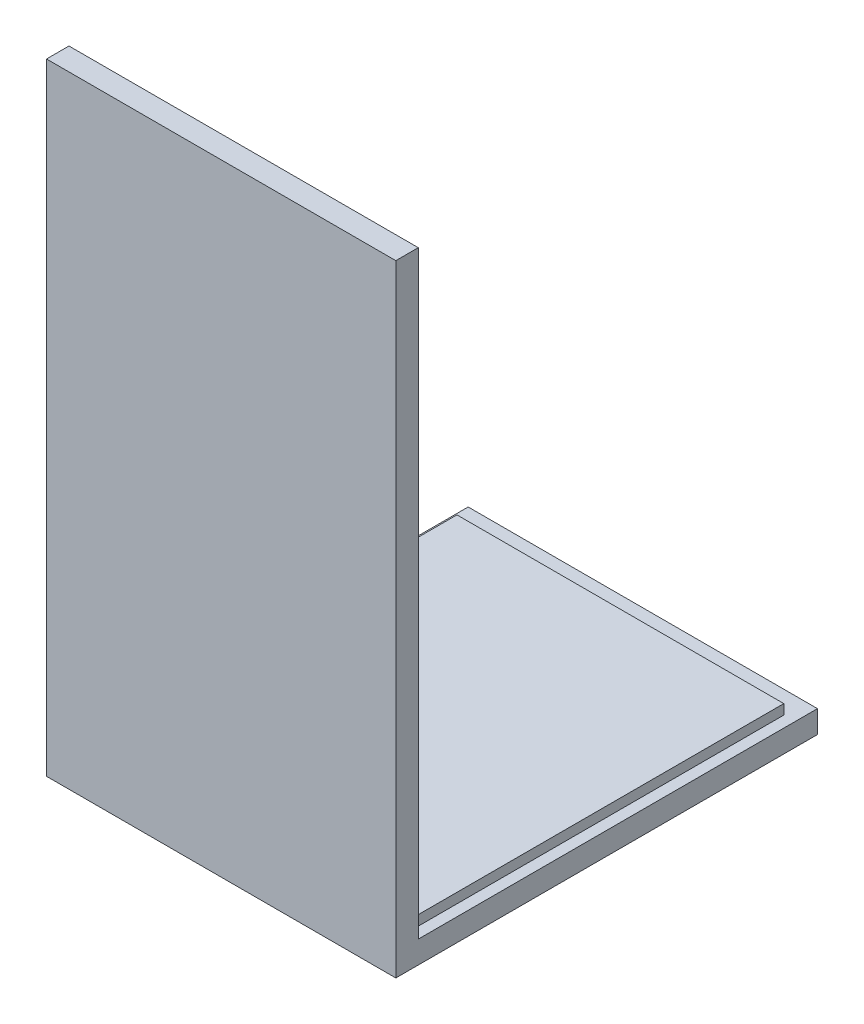
ISO-10303-21;
HEADER;
FILE_DESCRIPTION(('STEP AP214'),'2;1');
FILE_NAME('part.step','',(''),(''),'','','');
FILE_SCHEMA(('AUTOMOTIVE_DESIGN { 1 0 10303 214 1 1 1 1 }'));
ENDSEC;
DATA;
#1=APPLICATION_CONTEXT('core data for automotive mechanical design processes');
#2=APPLICATION_PROTOCOL_DEFINITION('international standard','automotive_design',2000,#1);
#3=PRODUCT_CONTEXT('',#1,'mechanical');
#4=PRODUCT('Part','Part','',(#3));
#5=PRODUCT_RELATED_PRODUCT_CATEGORY('part','',(#4));
#6=PRODUCT_DEFINITION_FORMATION('','',#4);
#7=PRODUCT_DEFINITION_CONTEXT('part definition',#1,'design');
#8=PRODUCT_DEFINITION('design','',#6,#7);
#9=PRODUCT_DEFINITION_SHAPE('','',#8);
#10=(LENGTH_UNIT() NAMED_UNIT(*) SI_UNIT(.MILLI.,.METRE.));
#11=(NAMED_UNIT(*) PLANE_ANGLE_UNIT() SI_UNIT($,.RADIAN.));
#12=(NAMED_UNIT(*) SI_UNIT($,.STERADIAN.) SOLID_ANGLE_UNIT());
#13=UNCERTAINTY_MEASURE_WITH_UNIT(LENGTH_MEASURE(1.E-05),#10,'distance_accuracy_value','');
#14=(GEOMETRIC_REPRESENTATION_CONTEXT(3) GLOBAL_UNCERTAINTY_ASSIGNED_CONTEXT((#13)) GLOBAL_UNIT_ASSIGNED_CONTEXT((#10,
#11,#12)) REPRESENTATION_CONTEXT('',''));
#15=CARTESIAN_POINT('',(0.,0.,0.));
#16=DIRECTION('',(0.,0.,1.));
#17=DIRECTION('',(1.,0.,0.));
#18=AXIS2_PLACEMENT_3D('',#15,#16,#17);
#19=CARTESIAN_POINT('',(0.,0.,0.));
#20=DIRECTION('',(0.,0.,-1.));
#21=DIRECTION('',(-1.,0.,0.));
#22=AXIS2_PLACEMENT_3D('',#19,#20,#21);
#23=PLANE('',#22);
#24=DIRECTION('',(1.,0.,0.));
#25=VECTOR('',#24,1.);
#26=CARTESIAN_POINT('',(-67.75,6.5,0.));
#27=LINE('',#26,#25);
#28=CARTESIAN_POINT('',(-67.75,6.5,0.));
#29=VERTEX_POINT('',#28);
#30=CARTESIAN_POINT('',(-2.25,6.5,0.));
#31=VERTEX_POINT('',#30);
#32=EDGE_CURVE('E142',#29,#31,#27,.T.);
#33=ORIENTED_EDGE('',*,*,#32,.F.);
#34=DIRECTION('',(0.,1.,0.));
#35=VECTOR('',#34,1.);
#36=CARTESIAN_POINT('',(-67.75,4.5,0.));
#37=LINE('',#36,#35);
#38=CARTESIAN_POINT('',(-67.75,4.5,0.));
#39=VERTEX_POINT('',#38);
#40=EDGE_CURVE('E139',#39,#29,#37,.T.);
#41=ORIENTED_EDGE('',*,*,#40,.F.);
#42=DIRECTION('',(1.,0.,0.));
#43=VECTOR('',#42,1.);
#44=CARTESIAN_POINT('',(-70.,4.5,0.));
#45=LINE('',#44,#43);
#46=CARTESIAN_POINT('',(-70.,4.5,0.));
#47=VERTEX_POINT('',#46);
#48=EDGE_CURVE('E71',#47,#39,#45,.T.);
#49=ORIENTED_EDGE('',*,*,#48,.F.);
#50=DIRECTION('',(0.,-1.,0.));
#51=VECTOR('',#50,1.);
#52=CARTESIAN_POINT('',(-70.,0.,0.));
#53=LINE('',#52,#51);
#54=CARTESIAN_POINT('',(-70.,124.5,0.));
#55=VERTEX_POINT('',#54);
#56=EDGE_CURVE('E196',#55,#47,#53,.T.);
#57=ORIENTED_EDGE('',*,*,#56,.F.);
#58=DIRECTION('',(-1.,0.,0.));
#59=VECTOR('',#58,1.);
#60=CARTESIAN_POINT('',(0.,124.5,0.));
#61=LINE('',#60,#59);
#62=CARTESIAN_POINT('',(0.,124.5,0.));
#63=VERTEX_POINT('',#62);
#64=EDGE_CURVE('E208',#63,#55,#61,.T.);
#65=ORIENTED_EDGE('',*,*,#64,.F.);
#66=DIRECTION('',(0.,1.,0.));
#67=VECTOR('',#66,1.);
#68=CARTESIAN_POINT('',(0.,0.,0.));
#69=LINE('',#68,#67);
#70=CARTESIAN_POINT('',(0.,4.5,0.));
#71=VERTEX_POINT('',#70);
#72=EDGE_CURVE('E190',#71,#63,#69,.T.);
#73=ORIENTED_EDGE('',*,*,#72,.F.);
#74=CARTESIAN_POINT('',(-2.25,4.5,0.));
#75=VERTEX_POINT('',#74);
#76=EDGE_CURVE('E182',#75,#71,#45,.T.);
#77=ORIENTED_EDGE('',*,*,#76,.F.);
#78=DIRECTION('',(0.,-1.,0.));
#79=VECTOR('',#78,1.);
#80=CARTESIAN_POINT('',(-2.25,4.5,0.));
#81=LINE('',#80,#79);
#82=EDGE_CURVE('E157',#31,#75,#81,.T.);
#83=ORIENTED_EDGE('',*,*,#82,.F.);
#84=EDGE_LOOP('',(#33,#41,#49,#57,#65,#73,#77,#83));
#85=FACE_BOUND('',#84,.T.);
#86=ADVANCED_FACE('F47',(#85),#23,.T.);
#87=CARTESIAN_POINT('',(-70.,4.5,-80.));
#88=DIRECTION('',(0.,-1.,0.));
#89=DIRECTION('',(0.,0.,-1.));
#90=AXIS2_PLACEMENT_3D('',#87,#88,#89);
#91=PLANE('',#90);
#92=DIRECTION('',(0.,0.,1.));
#93=VECTOR('',#92,1.);
#94=CARTESIAN_POINT('',(-67.75,4.5,-145.530527237311));
#95=LINE('',#94,#93);
#96=CARTESIAN_POINT('',(-67.75,4.5,-75.5));
#97=VERTEX_POINT('',#96);
#98=EDGE_CURVE('E161',#97,#39,#95,.T.);
#99=ORIENTED_EDGE('',*,*,#98,.F.);
#100=DIRECTION('',(-1.,0.,0.));
#101=VECTOR('',#100,1.);
#102=CARTESIAN_POINT('',(-67.75,4.5,-75.5));
#103=LINE('',#102,#101);
#104=CARTESIAN_POINT('',(-2.25,4.5,-75.5));
#105=VERTEX_POINT('',#104);
#106=EDGE_CURVE('E146',#105,#97,#103,.T.);
#107=ORIENTED_EDGE('',*,*,#106,.F.);
#108=DIRECTION('',(0.,0.,1.));
#109=VECTOR('',#108,1.);
#110=CARTESIAN_POINT('',(-2.25,4.5,-145.530527237311));
#111=LINE('',#110,#109);
#112=EDGE_CURVE('E151',#105,#75,#111,.T.);
#113=ORIENTED_EDGE('',*,*,#112,.T.);
#114=ORIENTED_EDGE('',*,*,#76,.T.);
#115=DIRECTION('',(0.,0.,1.));
#116=VECTOR('',#115,1.);
#117=CARTESIAN_POINT('',(0.,4.5,-80.));
#118=LINE('',#117,#116);
#119=CARTESIAN_POINT('',(0.,4.5,-80.));
#120=VERTEX_POINT('',#119);
#121=EDGE_CURVE('E179',#120,#71,#118,.T.);
#122=ORIENTED_EDGE('',*,*,#121,.F.);
#123=DIRECTION('',(1.,0.,0.));
#124=VECTOR('',#123,1.);
#125=CARTESIAN_POINT('',(-70.,4.5,-80.));
#126=LINE('',#125,#124);
#127=CARTESIAN_POINT('',(-70.,4.5,-80.));
#128=VERTEX_POINT('',#127);
#129=EDGE_CURVE('E168',#128,#120,#126,.T.);
#130=ORIENTED_EDGE('',*,*,#129,.F.);
#131=DIRECTION('',(0.,0.,1.));
#132=VECTOR('',#131,1.);
#133=CARTESIAN_POINT('',(-70.,4.5,-80.));
#134=LINE('',#133,#132);
#135=EDGE_CURVE('E186',#128,#47,#134,.T.);
#136=ORIENTED_EDGE('',*,*,#135,.T.);
#137=ORIENTED_EDGE('',*,*,#48,.T.);
#138=EDGE_LOOP('',(#99,#107,#113,#114,#122,#130,#136,#137));
#139=FACE_BOUND('',#138,.T.);
#140=ADVANCED_FACE('F235',(#139),#91,.F.);
#141=CARTESIAN_POINT('',(0.,0.,4.5));
#142=DIRECTION('',(0.,1.,0.));
#143=DIRECTION('',(0.,0.,1.));
#144=AXIS2_PLACEMENT_3D('',#141,#142,#143);
#145=PLANE('',#144);
#146=DIRECTION('',(0.,0.,-1.));
#147=VECTOR('',#146,1.);
#148=CARTESIAN_POINT('',(-70.,0.,4.5));
#149=LINE('',#148,#147);
#150=CARTESIAN_POINT('',(-70.,0.,4.5));
#151=VERTEX_POINT('',#150);
#152=CARTESIAN_POINT('',(-70.,0.,-80.));
#153=VERTEX_POINT('',#152);
#154=EDGE_CURVE('E205',#151,#153,#149,.T.);
#155=ORIENTED_EDGE('',*,*,#154,.T.);
#156=DIRECTION('',(-1.,0.,0.));
#157=VECTOR('',#156,1.);
#158=CARTESIAN_POINT('',(-70.,0.,-80.));
#159=LINE('',#158,#157);
#160=CARTESIAN_POINT('',(0.,0.,-80.));
#161=VERTEX_POINT('',#160);
#162=EDGE_CURVE('E175',#161,#153,#159,.T.);
#163=ORIENTED_EDGE('',*,*,#162,.F.);
#164=DIRECTION('',(0.,0.,-1.));
#165=VECTOR('',#164,1.);
#166=CARTESIAN_POINT('',(0.,0.,4.5));
#167=LINE('',#166,#165);
#168=CARTESIAN_POINT('',(0.,0.,4.5));
#169=VERTEX_POINT('',#168);
#170=EDGE_CURVE('E12',#169,#161,#167,.T.);
#171=ORIENTED_EDGE('',*,*,#170,.F.);
#172=DIRECTION('',(1.,0.,0.));
#173=VECTOR('',#172,1.);
#174=CARTESIAN_POINT('',(0.,0.,4.5));
#175=LINE('',#174,#173);
#176=EDGE_CURVE('E191',#151,#169,#175,.T.);
#177=ORIENTED_EDGE('',*,*,#176,.F.);
#178=EDGE_LOOP('',(#155,#163,#171,#177));
#179=FACE_BOUND('',#178,.T.);
#180=ADVANCED_FACE('F49',(#179),#145,.F.);
#181=CARTESIAN_POINT('',(0.,0.,4.5));
#182=DIRECTION('',(-1.,0.,0.));
#183=DIRECTION('',(0.,0.,1.));
#184=AXIS2_PLACEMENT_3D('',#181,#182,#183);
#185=PLANE('',#184);
#186=ORIENTED_EDGE('',*,*,#170,.T.);
#187=DIRECTION('',(0.,-1.,0.));
#188=VECTOR('',#187,1.);
#189=CARTESIAN_POINT('',(0.,0.,-80.));
#190=LINE('',#189,#188);
#191=EDGE_CURVE('E171',#120,#161,#190,.T.);
#192=ORIENTED_EDGE('',*,*,#191,.F.);
#193=ORIENTED_EDGE('',*,*,#121,.T.);
#194=ORIENTED_EDGE('',*,*,#72,.T.);
#195=DIRECTION('',(0.,0.,-1.));
#196=VECTOR('',#195,1.);
#197=CARTESIAN_POINT('',(0.,124.5,4.5));
#198=LINE('',#197,#196);
#199=CARTESIAN_POINT('',(0.,124.5,4.5));
#200=VERTEX_POINT('',#199);
#201=EDGE_CURVE('E56',#200,#63,#198,.T.);
#202=ORIENTED_EDGE('',*,*,#201,.F.);
#203=DIRECTION('',(0.,1.,0.));
#204=VECTOR('',#203,1.);
#205=CARTESIAN_POINT('',(0.,0.,4.5));
#206=LINE('',#205,#204);
#207=EDGE_CURVE('E195',#169,#200,#206,.T.);
#208=ORIENTED_EDGE('',*,*,#207,.F.);
#209=EDGE_LOOP('',(#186,#192,#193,#194,#202,#208));
#210=FACE_BOUND('',#209,.T.);
#211=ADVANCED_FACE('F247',(#210),#185,.F.);
#212=CARTESIAN_POINT('',(0.,124.5,4.5));
#213=DIRECTION('',(0.,-1.,0.));
#214=DIRECTION('',(0.,0.,-1.));
#215=AXIS2_PLACEMENT_3D('',#212,#213,#214);
#216=PLANE('',#215);
#217=ORIENTED_EDGE('',*,*,#64,.T.);
#218=DIRECTION('',(0.,0.,-1.));
#219=VECTOR('',#218,1.);
#220=CARTESIAN_POINT('',(-70.,124.5,4.5));
#221=LINE('',#220,#219);
#222=CARTESIAN_POINT('',(-70.,124.5,4.5));
#223=VERTEX_POINT('',#222);
#224=EDGE_CURVE('E215',#223,#55,#221,.T.);
#225=ORIENTED_EDGE('',*,*,#224,.F.);
#226=DIRECTION('',(-1.,0.,0.));
#227=VECTOR('',#226,1.);
#228=CARTESIAN_POINT('',(0.,124.5,4.5));
#229=LINE('',#228,#227);
#230=EDGE_CURVE('E199',#200,#223,#229,.T.);
#231=ORIENTED_EDGE('',*,*,#230,.F.);
#232=ORIENTED_EDGE('',*,*,#201,.T.);
#233=EDGE_LOOP('',(#217,#225,#231,#232));
#234=FACE_BOUND('',#233,.T.);
#235=ADVANCED_FACE('F224',(#234),#216,.F.);
#236=CARTESIAN_POINT('',(-70.,0.,4.5));
#237=DIRECTION('',(1.,0.,0.));
#238=DIRECTION('',(0.,0.,-1.));
#239=AXIS2_PLACEMENT_3D('',#236,#237,#238);
#240=PLANE('',#239);
#241=ORIENTED_EDGE('',*,*,#56,.T.);
#242=ORIENTED_EDGE('',*,*,#135,.F.);
#243=DIRECTION('',(0.,1.,0.));
#244=VECTOR('',#243,1.);
#245=CARTESIAN_POINT('',(-70.,0.,-80.));
#246=LINE('',#245,#244);
#247=EDGE_CURVE('E164',#153,#128,#246,.T.);
#248=ORIENTED_EDGE('',*,*,#247,.F.);
#249=ORIENTED_EDGE('',*,*,#154,.F.);
#250=DIRECTION('',(0.,-1.,0.));
#251=VECTOR('',#250,1.);
#252=CARTESIAN_POINT('',(-70.,0.,4.5));
#253=LINE('',#252,#251);
#254=EDGE_CURVE('E202',#223,#151,#253,.T.);
#255=ORIENTED_EDGE('',*,*,#254,.F.);
#256=ORIENTED_EDGE('',*,*,#224,.T.);
#257=EDGE_LOOP('',(#241,#242,#248,#249,#255,#256));
#258=FACE_BOUND('',#257,.T.);
#259=ADVANCED_FACE('F231',(#258),#240,.F.);
#260=CARTESIAN_POINT('',(0.,0.,4.5));
#261=DIRECTION('',(0.,0.,-1.));
#262=DIRECTION('',(-1.,0.,0.));
#263=AXIS2_PLACEMENT_3D('',#260,#261,#262);
#264=PLANE('',#263);
#265=ORIENTED_EDGE('',*,*,#176,.T.);
#266=ORIENTED_EDGE('',*,*,#207,.T.);
#267=ORIENTED_EDGE('',*,*,#230,.T.);
#268=ORIENTED_EDGE('',*,*,#254,.T.);
#269=EDGE_LOOP('',(#265,#266,#267,#268));
#270=FACE_BOUND('',#269,.T.);
#271=ADVANCED_FACE('F246',(#270),#264,.F.);
#272=CARTESIAN_POINT('',(0.,0.,-80.));
#273=DIRECTION('',(0.,0.,-1.));
#274=DIRECTION('',(-1.,0.,0.));
#275=AXIS2_PLACEMENT_3D('',#272,#273,#274);
#276=PLANE('',#275);
#277=ORIENTED_EDGE('',*,*,#247,.T.);
#278=ORIENTED_EDGE('',*,*,#129,.T.);
#279=ORIENTED_EDGE('',*,*,#191,.T.);
#280=ORIENTED_EDGE('',*,*,#162,.T.);
#281=EDGE_LOOP('',(#277,#278,#279,#280));
#282=FACE_BOUND('',#281,.T.);
#283=ADVANCED_FACE('F239',(#282),#276,.T.);
#284=CARTESIAN_POINT('',(-67.75,4.5,-145.530527237311));
#285=DIRECTION('',(1.,0.,0.));
#286=DIRECTION('',(0.,0.,-1.));
#287=AXIS2_PLACEMENT_3D('',#284,#285,#286);
#288=PLANE('',#287);
#289=DIRECTION('',(0.,1.,0.));
#290=VECTOR('',#289,1.);
#291=CARTESIAN_POINT('',(-67.75,4.5,-75.5));
#292=LINE('',#291,#290);
#293=CARTESIAN_POINT('',(-67.75,6.5,-75.5));
#294=VERTEX_POINT('',#293);
#295=EDGE_CURVE('E135',#97,#294,#292,.T.);
#296=ORIENTED_EDGE('',*,*,#295,.F.);
#297=ORIENTED_EDGE('',*,*,#98,.T.);
#298=ORIENTED_EDGE('',*,*,#40,.T.);
#299=DIRECTION('',(0.,0.,1.));
#300=VECTOR('',#299,1.);
#301=CARTESIAN_POINT('',(-67.75,6.5,-145.530527237311));
#302=LINE('',#301,#300);
#303=EDGE_CURVE('E130',#294,#29,#302,.T.);
#304=ORIENTED_EDGE('',*,*,#303,.F.);
#305=EDGE_LOOP('',(#296,#297,#298,#304));
#306=FACE_BOUND('',#305,.T.);
#307=ADVANCED_FACE('F138',(#306),#288,.F.);
#308=CARTESIAN_POINT('',(-67.75,6.5,-145.530527237311));
#309=DIRECTION('',(0.,-1.,0.));
#310=DIRECTION('',(0.,0.,-1.));
#311=AXIS2_PLACEMENT_3D('',#308,#309,#310);
#312=PLANE('',#311);
#313=DIRECTION('',(1.,0.,0.));
#314=VECTOR('',#313,1.);
#315=CARTESIAN_POINT('',(-67.75,6.5,-75.5));
#316=LINE('',#315,#314);
#317=CARTESIAN_POINT('',(-2.25,6.5,-75.5));
#318=VERTEX_POINT('',#317);
#319=EDGE_CURVE('E126',#294,#318,#316,.T.);
#320=ORIENTED_EDGE('',*,*,#319,.F.);
#321=ORIENTED_EDGE('',*,*,#303,.T.);
#322=ORIENTED_EDGE('',*,*,#32,.T.);
#323=DIRECTION('',(0.,0.,1.));
#324=VECTOR('',#323,1.);
#325=CARTESIAN_POINT('',(-2.25,6.5,-145.530527237311));
#326=LINE('',#325,#324);
#327=EDGE_CURVE('E132',#318,#31,#326,.T.);
#328=ORIENTED_EDGE('',*,*,#327,.F.);
#329=EDGE_LOOP('',(#320,#321,#322,#328));
#330=FACE_BOUND('',#329,.T.);
#331=ADVANCED_FACE('F128',(#330),#312,.F.);
#332=CARTESIAN_POINT('',(-2.25,4.5,-145.530527237311));
#333=DIRECTION('',(-1.,0.,0.));
#334=DIRECTION('',(0.,0.,1.));
#335=AXIS2_PLACEMENT_3D('',#332,#333,#334);
#336=PLANE('',#335);
#337=DIRECTION('',(0.,-1.,0.));
#338=VECTOR('',#337,1.);
#339=CARTESIAN_POINT('',(-2.25,4.5,-75.5));
#340=LINE('',#339,#338);
#341=EDGE_CURVE('E63',#318,#105,#340,.T.);
#342=ORIENTED_EDGE('',*,*,#341,.F.);
#343=ORIENTED_EDGE('',*,*,#327,.T.);
#344=ORIENTED_EDGE('',*,*,#82,.T.);
#345=ORIENTED_EDGE('',*,*,#112,.F.);
#346=EDGE_LOOP('',(#342,#343,#344,#345));
#347=FACE_BOUND('',#346,.T.);
#348=ADVANCED_FACE('F276',(#347),#336,.F.);
#349=CARTESIAN_POINT('',(0.,0.,-75.5));
#350=DIRECTION('',(0.,0.,-1.));
#351=DIRECTION('',(-1.,0.,0.));
#352=AXIS2_PLACEMENT_3D('',#349,#350,#351);
#353=PLANE('',#352);
#354=ORIENTED_EDGE('',*,*,#106,.T.);
#355=ORIENTED_EDGE('',*,*,#295,.T.);
#356=ORIENTED_EDGE('',*,*,#319,.T.);
#357=ORIENTED_EDGE('',*,*,#341,.T.);
#358=EDGE_LOOP('',(#354,#355,#356,#357));
#359=FACE_BOUND('',#358,.T.);
#360=ADVANCED_FACE('F144',(#359),#353,.T.);
#361=CLOSED_SHELL('',(#86,#140,#180,#211,#235,#259,#271,#283,#307,#331,#348,#360));
#362=MANIFOLD_SOLID_BREP('B2',#361);
#363=ADVANCED_BREP_SHAPE_REPRESENTATION('',(#18,#362),#14);
#364=SHAPE_DEFINITION_REPRESENTATION(#9,#363);
ENDSEC;
END-ISO-10303-21;
